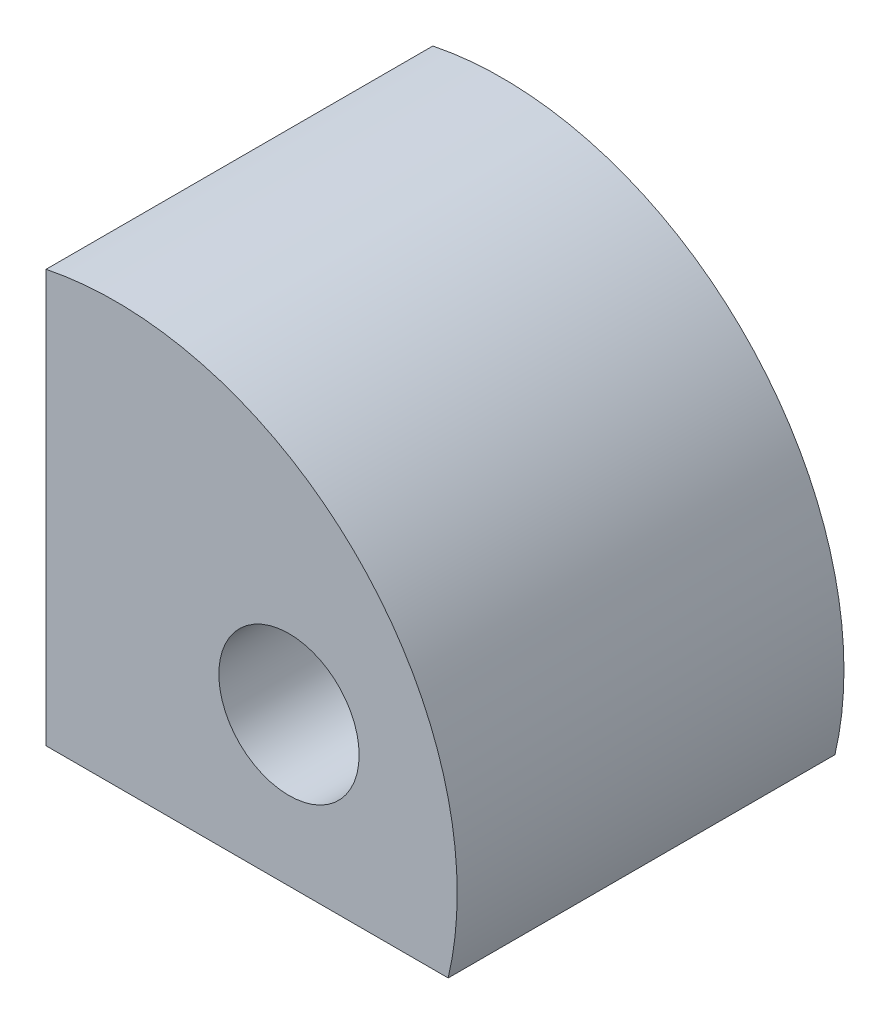
ISO-10303-21;
HEADER;
FILE_DESCRIPTION(('STEP AP214'),'2;1');
FILE_NAME('part.step','',(''),(''),'','','');
FILE_SCHEMA(('AUTOMOTIVE_DESIGN { 1 0 10303 214 1 1 1 1 }'));
ENDSEC;
DATA;
#1=APPLICATION_CONTEXT('core data for automotive mechanical design processes');
#2=APPLICATION_PROTOCOL_DEFINITION('international standard','automotive_design',2000,#1);
#3=PRODUCT_CONTEXT('',#1,'mechanical');
#4=PRODUCT('Part','Part','',(#3));
#5=PRODUCT_RELATED_PRODUCT_CATEGORY('part','',(#4));
#6=PRODUCT_DEFINITION_FORMATION('','',#4);
#7=PRODUCT_DEFINITION_CONTEXT('part definition',#1,'design');
#8=PRODUCT_DEFINITION('design','',#6,#7);
#9=PRODUCT_DEFINITION_SHAPE('','',#8);
#10=(LENGTH_UNIT() NAMED_UNIT(*) SI_UNIT(.MILLI.,.METRE.));
#11=(NAMED_UNIT(*) PLANE_ANGLE_UNIT() SI_UNIT($,.RADIAN.));
#12=(NAMED_UNIT(*) SI_UNIT($,.STERADIAN.) SOLID_ANGLE_UNIT());
#13=UNCERTAINTY_MEASURE_WITH_UNIT(LENGTH_MEASURE(1.E-05),#10,'distance_accuracy_value','');
#14=(GEOMETRIC_REPRESENTATION_CONTEXT(3) GLOBAL_UNCERTAINTY_ASSIGNED_CONTEXT((#13)) GLOBAL_UNIT_ASSIGNED_CONTEXT((#10,
#11,#12)) REPRESENTATION_CONTEXT('',''));
#15=CARTESIAN_POINT('',(0.,0.,0.));
#16=DIRECTION('',(0.,0.,1.));
#17=DIRECTION('',(1.,0.,0.));
#18=AXIS2_PLACEMENT_3D('',#15,#16,#17);
#19=CARTESIAN_POINT('',(-1.2151235167292,-2.86143504016257,9.37333333333333));
#20=DIRECTION('',(0.,0.,1.));
#21=DIRECTION('',(1.,0.,0.));
#22=AXIS2_PLACEMENT_3D('',#19,#20,#21);
#23=PLANE('',#22);
#24=CARTESIAN_POINT('',(-1.2151235167292,-2.86143504016257,9.37333333333333));
#25=DIRECTION('',(0.,0.,1.));
#26=DIRECTION('',(1.,0.,0.));
#27=AXIS2_PLACEMENT_3D('',#24,#25,#26);
#28=CIRCLE('',#27,8.28554143514574);
#29=CARTESIAN_POINT('',(6.85253507844266,-4.74904772958444,9.37333333333333));
#30=VERTEX_POINT('',#29);
#31=CARTESIAN_POINT('',(-2.89418707960662,5.25219191856151,9.37333333333333));
#32=VERTEX_POINT('',#31);
#33=EDGE_CURVE('E84',#30,#32,#28,.T.);
#34=ORIENTED_EDGE('',*,*,#33,.T.);
#35=DIRECTION('',(0.,-1.,0.));
#36=VECTOR('',#35,1.);
#37=CARTESIAN_POINT('',(-2.89418707960662,5.25219191856151,9.37333333333333));
#38=LINE('',#37,#36);
#39=CARTESIAN_POINT('',(-2.89418707960662,-4.74904772958444,9.37333333333333));
#40=VERTEX_POINT('',#39);
#41=EDGE_CURVE('E79',#32,#40,#38,.T.);
#42=ORIENTED_EDGE('',*,*,#41,.T.);
#43=DIRECTION('',(1.,0.,0.));
#44=VECTOR('',#43,1.);
#45=CARTESIAN_POINT('',(6.85253507844266,-4.74904772958444,9.37333333333333));
#46=LINE('',#45,#44);
#47=EDGE_CURVE('E59',#40,#30,#46,.T.);
#48=ORIENTED_EDGE('',*,*,#47,.T.);
#49=EDGE_LOOP('',(#34,#42,#48));
#50=FACE_BOUND('',#49,.T.);
#51=CARTESIAN_POINT('',(2.99372427545906,-1.14904772958444,9.37333333333333));
#52=DIRECTION('',(0.,0.,1.));
#53=DIRECTION('',(1.,0.,0.));
#54=AXIS2_PLACEMENT_3D('',#51,#52,#53);
#55=CIRCLE('',#54,1.7);
#56=CARTESIAN_POINT('',(4.69372427545906,-1.14904772958444,9.37333333333333));
#57=VERTEX_POINT('',#56);
#58=EDGE_CURVE('E96',#57,#57,#55,.T.);
#59=ORIENTED_EDGE('',*,*,#58,.F.);
#60=EDGE_LOOP('',(#59));
#61=FACE_BOUND('',#60,.T.);
#62=ADVANCED_FACE('F41',(#50,#61),#23,.T.);
#63=CARTESIAN_POINT('',(-1.2151235167292,-2.86143504016257,0.));
#64=DIRECTION('',(0.,0.,1.));
#65=DIRECTION('',(1.,0.,0.));
#66=AXIS2_PLACEMENT_3D('',#63,#64,#65);
#67=PLANE('',#66);
#68=CARTESIAN_POINT('',(-1.2151235167292,-2.86143504016257,0.));
#69=DIRECTION('',(0.,0.,1.));
#70=DIRECTION('',(1.,0.,0.));
#71=AXIS2_PLACEMENT_3D('',#68,#69,#70);
#72=CIRCLE('',#71,8.28554143514574);
#73=CARTESIAN_POINT('',(6.85253507844266,-4.74904772958444,0.));
#74=VERTEX_POINT('',#73);
#75=CARTESIAN_POINT('',(-2.89418707960662,5.25219191856151,0.));
#76=VERTEX_POINT('',#75);
#77=EDGE_CURVE('E92',#74,#76,#72,.T.);
#78=ORIENTED_EDGE('',*,*,#77,.F.);
#79=DIRECTION('',(1.,0.,0.));
#80=VECTOR('',#79,1.);
#81=CARTESIAN_POINT('',(6.85253507844266,-4.74904772958444,0.));
#82=LINE('',#81,#80);
#83=CARTESIAN_POINT('',(-2.89418707960662,-4.74904772958444,0.));
#84=VERTEX_POINT('',#83);
#85=EDGE_CURVE('E76',#84,#74,#82,.T.);
#86=ORIENTED_EDGE('',*,*,#85,.F.);
#87=DIRECTION('',(0.,-1.,0.));
#88=VECTOR('',#87,1.);
#89=CARTESIAN_POINT('',(-2.89418707960662,5.25219191856151,0.));
#90=LINE('',#89,#88);
#91=EDGE_CURVE('E71',#76,#84,#90,.T.);
#92=ORIENTED_EDGE('',*,*,#91,.F.);
#93=EDGE_LOOP('',(#78,#86,#92));
#94=FACE_BOUND('',#93,.T.);
#95=CARTESIAN_POINT('',(2.99372427545906,-1.14904772958444,0.));
#96=DIRECTION('',(0.,0.,1.));
#97=DIRECTION('',(1.,0.,0.));
#98=AXIS2_PLACEMENT_3D('',#95,#96,#97);
#99=CIRCLE('',#98,1.7);
#100=CARTESIAN_POINT('',(4.69372427545906,-1.14904772958444,0.));
#101=VERTEX_POINT('',#100);
#102=EDGE_CURVE('E102',#101,#101,#99,.T.);
#103=ORIENTED_EDGE('',*,*,#102,.T.);
#104=EDGE_LOOP('',(#103));
#105=FACE_BOUND('',#104,.T.);
#106=ADVANCED_FACE('F111',(#94,#105),#67,.F.);
#107=CARTESIAN_POINT('',(-1.2151235167292,-2.86143504016257,9.37333333333333));
#108=DIRECTION('',(0.,0.,-1.));
#109=DIRECTION('',(-1.,0.,0.));
#110=AXIS2_PLACEMENT_3D('',#107,#108,#109);
#111=CYLINDRICAL_SURFACE('',#110,8.28554143514574);
#112=ORIENTED_EDGE('',*,*,#77,.T.);
#113=DIRECTION('',(0.,0.,-1.));
#114=VECTOR('',#113,1.);
#115=CARTESIAN_POINT('',(-2.89418707960662,5.25219191856151,9.37333333333333));
#116=LINE('',#115,#114);
#117=EDGE_CURVE('E11',#32,#76,#116,.T.);
#118=ORIENTED_EDGE('',*,*,#117,.F.);
#119=ORIENTED_EDGE('',*,*,#33,.F.);
#120=DIRECTION('',(0.,0.,-1.));
#121=VECTOR('',#120,1.);
#122=CARTESIAN_POINT('',(6.85253507844266,-4.74904772958444,9.37333333333333));
#123=LINE('',#122,#121);
#124=EDGE_CURVE('E93',#30,#74,#123,.T.);
#125=ORIENTED_EDGE('',*,*,#124,.T.);
#126=EDGE_LOOP('',(#112,#118,#119,#125));
#127=FACE_BOUND('',#126,.T.);
#128=ADVANCED_FACE('F43',(#127),#111,.T.);
#129=CARTESIAN_POINT('',(-2.89418707960662,5.25219191856151,9.37333333333333));
#130=DIRECTION('',(1.,0.,0.));
#131=DIRECTION('',(0.,0.,-1.));
#132=AXIS2_PLACEMENT_3D('',#129,#130,#131);
#133=PLANE('',#132);
#134=ORIENTED_EDGE('',*,*,#91,.T.);
#135=DIRECTION('',(0.,0.,-1.));
#136=VECTOR('',#135,1.);
#137=CARTESIAN_POINT('',(-2.89418707960662,-4.74904772958444,9.37333333333333));
#138=LINE('',#137,#136);
#139=EDGE_CURVE('E51',#40,#84,#138,.T.);
#140=ORIENTED_EDGE('',*,*,#139,.F.);
#141=ORIENTED_EDGE('',*,*,#41,.F.);
#142=ORIENTED_EDGE('',*,*,#117,.T.);
#143=EDGE_LOOP('',(#134,#140,#141,#142));
#144=FACE_BOUND('',#143,.T.);
#145=ADVANCED_FACE('F80',(#144),#133,.F.);
#146=CARTESIAN_POINT('',(6.85253507844266,-4.74904772958444,9.37333333333333));
#147=DIRECTION('',(0.,1.,0.));
#148=DIRECTION('',(0.,0.,1.));
#149=AXIS2_PLACEMENT_3D('',#146,#147,#148);
#150=PLANE('',#149);
#151=ORIENTED_EDGE('',*,*,#85,.T.);
#152=ORIENTED_EDGE('',*,*,#124,.F.);
#153=ORIENTED_EDGE('',*,*,#47,.F.);
#154=ORIENTED_EDGE('',*,*,#139,.T.);
#155=EDGE_LOOP('',(#151,#152,#153,#154));
#156=FACE_BOUND('',#155,.T.);
#157=ADVANCED_FACE('F110',(#156),#150,.F.);
#158=CARTESIAN_POINT('',(2.99372427545906,-1.14904772958444,9.37333333333333));
#159=DIRECTION('',(0.,0.,-1.));
#160=DIRECTION('',(-1.,0.,0.));
#161=AXIS2_PLACEMENT_3D('',#158,#159,#160);
#162=CYLINDRICAL_SURFACE('',#161,1.7);
#163=ORIENTED_EDGE('',*,*,#58,.T.);
#164=EDGE_LOOP('',(#163));
#165=FACE_BOUND('',#164,.T.);
#166=ORIENTED_EDGE('',*,*,#102,.F.);
#167=EDGE_LOOP('',(#166));
#168=FACE_BOUND('',#167,.T.);
#169=ADVANCED_FACE('F120',(#165,#168),#162,.F.);
#170=CLOSED_SHELL('',(#62,#106,#128,#145,#157,#169));
#171=MANIFOLD_SOLID_BREP('B2',#170);
#172=ADVANCED_BREP_SHAPE_REPRESENTATION('',(#18,#171),#14);
#173=SHAPE_DEFINITION_REPRESENTATION(#9,#172);
ENDSEC;
END-ISO-10303-21;
